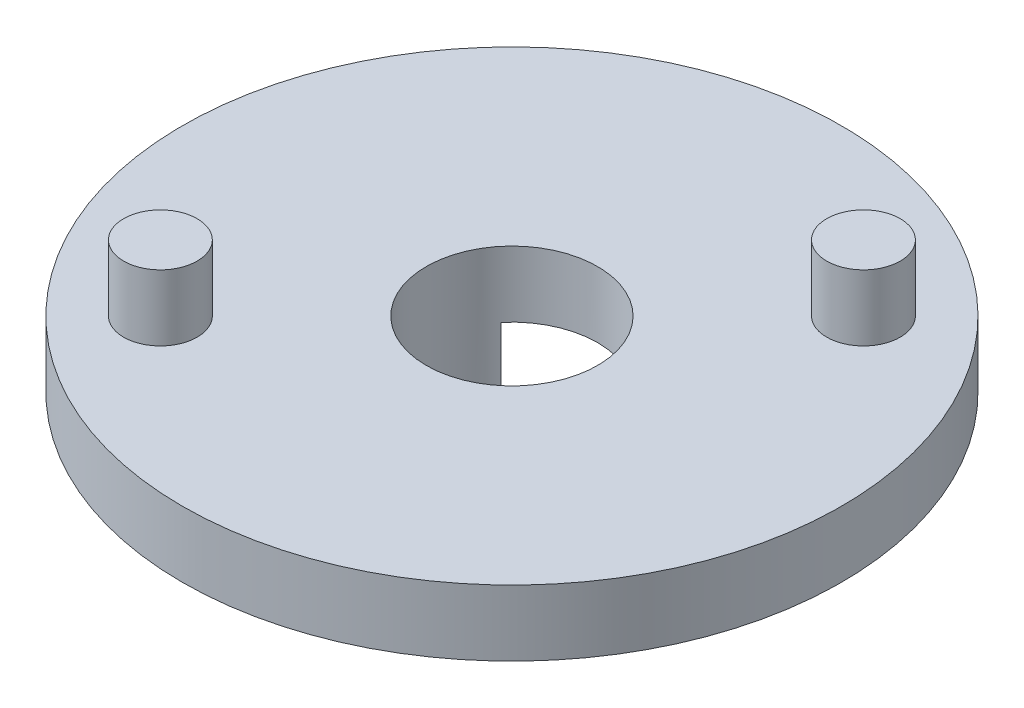
ISO-10303-21;
HEADER;
FILE_DESCRIPTION(('STEP AP214'),'2;1');
FILE_NAME('part.step','',(''),(''),'','','');
FILE_SCHEMA(('AUTOMOTIVE_DESIGN { 1 0 10303 214 1 1 1 1 }'));
ENDSEC;
DATA;
#1=APPLICATION_CONTEXT('core data for automotive mechanical design processes');
#2=APPLICATION_PROTOCOL_DEFINITION('international standard','automotive_design',2000,#1);
#3=PRODUCT_CONTEXT('',#1,'mechanical');
#4=PRODUCT('Part','Part','',(#3));
#5=PRODUCT_RELATED_PRODUCT_CATEGORY('part','',(#4));
#6=PRODUCT_DEFINITION_FORMATION('','',#4);
#7=PRODUCT_DEFINITION_CONTEXT('part definition',#1,'design');
#8=PRODUCT_DEFINITION('design','',#6,#7);
#9=PRODUCT_DEFINITION_SHAPE('','',#8);
#10=(LENGTH_UNIT() NAMED_UNIT(*) SI_UNIT(.MILLI.,.METRE.));
#11=(NAMED_UNIT(*) PLANE_ANGLE_UNIT() SI_UNIT($,.RADIAN.));
#12=(NAMED_UNIT(*) SI_UNIT($,.STERADIAN.) SOLID_ANGLE_UNIT());
#13=UNCERTAINTY_MEASURE_WITH_UNIT(LENGTH_MEASURE(1.E-05),#10,'distance_accuracy_value','');
#14=(GEOMETRIC_REPRESENTATION_CONTEXT(3) GLOBAL_UNCERTAINTY_ASSIGNED_CONTEXT((#13)) GLOBAL_UNIT_ASSIGNED_CONTEXT((#10,
#11,#12)) REPRESENTATION_CONTEXT('',''));
#15=CARTESIAN_POINT('',(0.,0.,0.));
#16=DIRECTION('',(0.,0.,1.));
#17=DIRECTION('',(1.,0.,0.));
#18=AXIS2_PLACEMENT_3D('',#15,#16,#17);
#19=CARTESIAN_POINT('',(-2.6167728216259,1.75,1.25));
#20=DIRECTION('',(0.,0.,-1.));
#21=DIRECTION('',(-1.,0.,0.));
#22=AXIS2_PLACEMENT_3D('',#19,#20,#21);
#23=PLANE('',#22);
#24=DIRECTION('',(1.,0.,0.));
#25=VECTOR('',#24,1.);
#26=CARTESIAN_POINT('',(-2.6167728216259,0.,1.25));
#27=LINE('',#26,#25);
#28=CARTESIAN_POINT('',(-2.6167728216259,0.,1.25));
#29=VERTEX_POINT('',#28);
#30=CARTESIAN_POINT('',(-1.49666295470958,0.,1.25));
#31=VERTEX_POINT('',#30);
#32=EDGE_CURVE('E98',#29,#31,#27,.T.);
#33=ORIENTED_EDGE('',*,*,#32,.T.);
#34=DIRECTION('',(0.,1.,0.));
#35=VECTOR('',#34,1.);
#36=CARTESIAN_POINT('',(-1.49666295470958,0.,1.25));
#37=LINE('',#36,#35);
#38=CARTESIAN_POINT('',(-1.49666295470958,1.75,1.25));
#39=VERTEX_POINT('',#38);
#40=EDGE_CURVE('E174',#31,#39,#37,.T.);
#41=ORIENTED_EDGE('',*,*,#40,.T.);
#42=DIRECTION('',(1.,0.,0.));
#43=VECTOR('',#42,1.);
#44=CARTESIAN_POINT('',(-2.6167728216259,1.75,1.25));
#45=LINE('',#44,#43);
#46=CARTESIAN_POINT('',(-2.6167728216259,1.75,1.25));
#47=VERTEX_POINT('',#46);
#48=EDGE_CURVE('E138',#47,#39,#45,.T.);
#49=ORIENTED_EDGE('',*,*,#48,.F.);
#50=DIRECTION('',(0.,-1.,0.));
#51=VECTOR('',#50,1.);
#52=CARTESIAN_POINT('',(-2.6167728216259,1.75,1.25));
#53=LINE('',#52,#51);
#54=EDGE_CURVE('E11',#47,#29,#53,.T.);
#55=ORIENTED_EDGE('',*,*,#54,.T.);
#56=EDGE_LOOP('',(#33,#41,#49,#55));
#57=FACE_BOUND('',#56,.T.);
#58=ADVANCED_FACE('F36',(#57),#23,.F.);
#59=CARTESIAN_POINT('',(-2.6167728216259,1.75,-1.25));
#60=DIRECTION('',(0.,0.,-1.));
#61=DIRECTION('',(-1.,0.,0.));
#62=AXIS2_PLACEMENT_3D('',#59,#60,#61);
#63=PLANE('',#62);
#64=DIRECTION('',(0.,1.,0.));
#65=VECTOR('',#64,1.);
#66=CARTESIAN_POINT('',(-1.49666295470958,0.,-1.25));
#67=LINE('',#66,#65);
#68=CARTESIAN_POINT('',(-1.49666295470958,0.,-1.25));
#69=VERTEX_POINT('',#68);
#70=CARTESIAN_POINT('',(-1.49666295470958,1.75,-1.25));
#71=VERTEX_POINT('',#70);
#72=EDGE_CURVE('E131',#69,#71,#67,.T.);
#73=ORIENTED_EDGE('',*,*,#72,.F.);
#74=DIRECTION('',(1.,0.,0.));
#75=VECTOR('',#74,1.);
#76=CARTESIAN_POINT('',(-2.6167728216259,0.,-1.25));
#77=LINE('',#76,#75);
#78=CARTESIAN_POINT('',(-2.6167728216259,0.,-1.25));
#79=VERTEX_POINT('',#78);
#80=EDGE_CURVE('E86',#79,#69,#77,.T.);
#81=ORIENTED_EDGE('',*,*,#80,.F.);
#82=DIRECTION('',(0.,-1.,0.));
#83=VECTOR('',#82,1.);
#84=CARTESIAN_POINT('',(-2.6167728216259,1.75,-1.25));
#85=LINE('',#84,#83);
#86=CARTESIAN_POINT('',(-2.6167728216259,1.75,-1.25));
#87=VERTEX_POINT('',#86);
#88=EDGE_CURVE('E93',#87,#79,#85,.T.);
#89=ORIENTED_EDGE('',*,*,#88,.F.);
#90=DIRECTION('',(1.,0.,0.));
#91=VECTOR('',#90,1.);
#92=CARTESIAN_POINT('',(-2.6167728216259,1.75,-1.25));
#93=LINE('',#92,#91);
#94=EDGE_CURVE('E107',#87,#71,#93,.T.);
#95=ORIENTED_EDGE('',*,*,#94,.T.);
#96=EDGE_LOOP('',(#73,#81,#89,#95));
#97=FACE_BOUND('',#96,.T.);
#98=ADVANCED_FACE('F171',(#97),#63,.T.);
#99=CARTESIAN_POINT('',(0.,0.,0.));
#100=DIRECTION('',(0.,1.,0.));
#101=DIRECTION('',(0.,0.,1.));
#102=AXIS2_PLACEMENT_3D('',#99,#100,#101);
#103=PLANE('',#102);
#104=CARTESIAN_POINT('',(1.49666295470958,0.,1.25));
#105=VERTEX_POINT('',#104);
#106=CARTESIAN_POINT('',(2.6167728216259,0.,1.25));
#107=VERTEX_POINT('',#106);
#108=EDGE_CURVE('E101',#105,#107,#27,.T.);
#109=ORIENTED_EDGE('',*,*,#108,.F.);
#110=CARTESIAN_POINT('',(0.,0.,0.));
#111=DIRECTION('',(0.,1.,0.));
#112=DIRECTION('',(0.,0.,1.));
#113=AXIS2_PLACEMENT_3D('',#110,#111,#112);
#114=CIRCLE('',#113,1.95);
#115=CARTESIAN_POINT('',(1.49666295470958,0.,-1.25));
#116=VERTEX_POINT('',#115);
#117=EDGE_CURVE('E85',#105,#116,#114,.T.);
#118=ORIENTED_EDGE('',*,*,#117,.T.);
#119=CARTESIAN_POINT('',(2.6167728216259,0.,-1.25));
#120=VERTEX_POINT('',#119);
#121=EDGE_CURVE('E79',#116,#120,#77,.T.);
#122=ORIENTED_EDGE('',*,*,#121,.T.);
#123=CARTESIAN_POINT('',(0.,0.,0.));
#124=DIRECTION('',(0.,1.,0.));
#125=DIRECTION('',(0.,0.,1.));
#126=AXIS2_PLACEMENT_3D('',#123,#124,#125);
#127=CIRCLE('',#126,2.9);
#128=EDGE_CURVE('E83',#107,#120,#127,.T.);
#129=ORIENTED_EDGE('',*,*,#128,.F.);
#130=EDGE_LOOP('',(#109,#118,#122,#129));
#131=FACE_BOUND('',#130,.T.);
#132=ADVANCED_FACE('F81',(#131),#103,.F.);
#133=CARTESIAN_POINT('',(0.,1.75,0.));
#134=DIRECTION('',(0.,-1.,0.));
#135=DIRECTION('',(0.,0.,-1.));
#136=AXIS2_PLACEMENT_3D('',#133,#134,#135);
#137=CYLINDRICAL_SURFACE('',#136,2.9);
#138=CARTESIAN_POINT('',(0.,0.,0.));
#139=DIRECTION('',(0.,1.,0.));
#140=DIRECTION('',(0.,0.,1.));
#141=AXIS2_PLACEMENT_3D('',#138,#139,#140);
#142=CIRCLE('',#141,2.9);
#143=EDGE_CURVE('E122',#79,#29,#142,.T.);
#144=ORIENTED_EDGE('',*,*,#143,.T.);
#145=ORIENTED_EDGE('',*,*,#54,.F.);
#146=CARTESIAN_POINT('',(0.,1.75,0.));
#147=DIRECTION('',(0.,1.,0.));
#148=DIRECTION('',(0.,0.,1.));
#149=AXIS2_PLACEMENT_3D('',#146,#147,#148);
#150=CIRCLE('',#149,2.9);
#151=EDGE_CURVE('E106',#87,#47,#150,.T.);
#152=ORIENTED_EDGE('',*,*,#151,.F.);
#153=ORIENTED_EDGE('',*,*,#88,.T.);
#154=EDGE_LOOP('',(#144,#145,#152,#153));
#155=FACE_BOUND('',#154,.T.);
#156=ADVANCED_FACE('F38',(#155),#137,.T.);
#157=CARTESIAN_POINT('',(1.49666295470958,1.75,1.25));
#158=VERTEX_POINT('',#157);
#159=CARTESIAN_POINT('',(2.6167728216259,1.75,1.25));
#160=VERTEX_POINT('',#159);
#161=EDGE_CURVE('E137',#158,#160,#45,.T.);
#162=ORIENTED_EDGE('',*,*,#161,.F.);
#163=DIRECTION('',(0.,1.,0.));
#164=VECTOR('',#163,1.);
#165=CARTESIAN_POINT('',(1.49666295470958,0.,1.25));
#166=LINE('',#165,#164);
#167=EDGE_CURVE('E51',#158,#105,#166,.F.);
#168=ORIENTED_EDGE('',*,*,#167,.T.);
#169=ORIENTED_EDGE('',*,*,#108,.T.);
#170=DIRECTION('',(0.,-1.,0.));
#171=VECTOR('',#170,1.);
#172=CARTESIAN_POINT('',(2.6167728216259,1.75,1.25));
#173=LINE('',#172,#171);
#174=EDGE_CURVE('E44',#160,#107,#173,.T.);
#175=ORIENTED_EDGE('',*,*,#174,.F.);
#176=EDGE_LOOP('',(#162,#168,#169,#175));
#177=FACE_BOUND('',#176,.T.);
#178=ADVANCED_FACE('F150',(#177),#23,.F.);
#179=CARTESIAN_POINT('',(0.,1.75,0.));
#180=DIRECTION('',(0.,-1.,0.));
#181=DIRECTION('',(0.,0.,-1.));
#182=AXIS2_PLACEMENT_3D('',#179,#180,#181);
#183=CYLINDRICAL_SURFACE('',#182,2.9);
#184=ORIENTED_EDGE('',*,*,#128,.T.);
#185=DIRECTION('',(0.,-1.,0.));
#186=VECTOR('',#185,1.);
#187=CARTESIAN_POINT('',(2.6167728216259,1.75,-1.25));
#188=LINE('',#187,#186);
#189=CARTESIAN_POINT('',(2.6167728216259,1.75,-1.25));
#190=VERTEX_POINT('',#189);
#191=EDGE_CURVE('E89',#190,#120,#188,.T.);
#192=ORIENTED_EDGE('',*,*,#191,.F.);
#193=CARTESIAN_POINT('',(0.,1.75,0.));
#194=DIRECTION('',(0.,1.,0.));
#195=DIRECTION('',(0.,0.,1.));
#196=AXIS2_PLACEMENT_3D('',#193,#194,#195);
#197=CIRCLE('',#196,2.9);
#198=EDGE_CURVE('E119',#160,#190,#197,.T.);
#199=ORIENTED_EDGE('',*,*,#198,.F.);
#200=ORIENTED_EDGE('',*,*,#174,.T.);
#201=EDGE_LOOP('',(#184,#192,#199,#200));
#202=FACE_BOUND('',#201,.T.);
#203=ADVANCED_FACE('F96',(#202),#183,.T.);
#204=DIRECTION('',(0.,1.,0.));
#205=VECTOR('',#204,1.);
#206=CARTESIAN_POINT('',(1.49666295470958,0.,-1.25));
#207=LINE('',#206,#205);
#208=CARTESIAN_POINT('',(1.49666295470958,1.75,-1.25));
#209=VERTEX_POINT('',#208);
#210=EDGE_CURVE('E177',#209,#116,#207,.F.);
#211=ORIENTED_EDGE('',*,*,#210,.F.);
#212=EDGE_CURVE('E60',#209,#190,#93,.T.);
#213=ORIENTED_EDGE('',*,*,#212,.T.);
#214=ORIENTED_EDGE('',*,*,#191,.T.);
#215=ORIENTED_EDGE('',*,*,#121,.F.);
#216=EDGE_LOOP('',(#211,#213,#214,#215));
#217=FACE_BOUND('',#216,.T.);
#218=ADVANCED_FACE('F90',(#217),#63,.T.);
#219=ORIENTED_EDGE('',*,*,#80,.T.);
#220=EDGE_CURVE('E182',#69,#31,#114,.T.);
#221=ORIENTED_EDGE('',*,*,#220,.T.);
#222=ORIENTED_EDGE('',*,*,#32,.F.);
#223=ORIENTED_EDGE('',*,*,#143,.F.);
#224=EDGE_LOOP('',(#219,#221,#222,#223));
#225=FACE_BOUND('',#224,.T.);
#226=ADVANCED_FACE('F184',(#225),#103,.F.);
#227=CARTESIAN_POINT('',(0.,1.75,0.));
#228=DIRECTION('',(0.,1.,0.));
#229=DIRECTION('',(0.,0.,1.));
#230=AXIS2_PLACEMENT_3D('',#227,#228,#229);
#231=PLANE('',#230);
#232=CARTESIAN_POINT('',(0.,1.75,0.));
#233=DIRECTION('',(0.,1.,0.));
#234=DIRECTION('',(0.,0.,1.));
#235=AXIS2_PLACEMENT_3D('',#232,#233,#234);
#236=CIRCLE('',#235,7.5);
#237=CARTESIAN_POINT('',(0.,1.75,7.5));
#238=VERTEX_POINT('',#237);
#239=EDGE_CURVE('E126',#238,#238,#236,.T.);
#240=ORIENTED_EDGE('',*,*,#239,.F.);
#241=EDGE_LOOP('',(#240));
#242=FACE_BOUND('',#241,.T.);
#243=ORIENTED_EDGE('',*,*,#212,.F.);
#244=CARTESIAN_POINT('',(0.,1.75,0.));
#245=DIRECTION('',(0.,1.,0.));
#246=DIRECTION('',(0.,0.,1.));
#247=AXIS2_PLACEMENT_3D('',#244,#245,#246);
#248=CIRCLE('',#247,1.95);
#249=EDGE_CURVE('E169',#209,#71,#248,.T.);
#250=ORIENTED_EDGE('',*,*,#249,.T.);
#251=ORIENTED_EDGE('',*,*,#94,.F.);
#252=ORIENTED_EDGE('',*,*,#151,.T.);
#253=ORIENTED_EDGE('',*,*,#48,.T.);
#254=EDGE_CURVE('E147',#39,#158,#248,.T.);
#255=ORIENTED_EDGE('',*,*,#254,.T.);
#256=ORIENTED_EDGE('',*,*,#161,.T.);
#257=ORIENTED_EDGE('',*,*,#198,.T.);
#258=EDGE_LOOP('',(#243,#250,#251,#252,#253,#255,#256,#257));
#259=FACE_BOUND('',#258,.T.);
#260=ADVANCED_FACE('F146',(#242,#259),#231,.F.);
#261=CARTESIAN_POINT('',(0.,3.25,0.));
#262=DIRECTION('',(0.,-1.,0.));
#263=DIRECTION('',(0.,0.,-1.));
#264=AXIS2_PLACEMENT_3D('',#261,#262,#263);
#265=CYLINDRICAL_SURFACE('',#264,7.5);
#266=CARTESIAN_POINT('',(0.,3.25,0.));
#267=DIRECTION('',(0.,1.,0.));
#268=DIRECTION('',(0.,0.,1.));
#269=AXIS2_PLACEMENT_3D('',#266,#267,#268);
#270=CIRCLE('',#269,7.5);
#271=CARTESIAN_POINT('',(0.,3.25,7.5));
#272=VERTEX_POINT('',#271);
#273=EDGE_CURVE('E123',#272,#272,#270,.T.);
#274=ORIENTED_EDGE('',*,*,#273,.F.);
#275=EDGE_LOOP('',(#274));
#276=FACE_BOUND('',#275,.T.);
#277=ORIENTED_EDGE('',*,*,#239,.T.);
#278=EDGE_LOOP('',(#277));
#279=FACE_BOUND('',#278,.T.);
#280=ADVANCED_FACE('F215',(#276,#279),#265,.T.);
#281=CARTESIAN_POINT('',(0.,3.25,0.));
#282=DIRECTION('',(0.,1.,0.));
#283=DIRECTION('',(0.,0.,1.));
#284=AXIS2_PLACEMENT_3D('',#281,#282,#283);
#285=PLANE('',#284);
#286=CARTESIAN_POINT('',(-4.,3.25,4.));
#287=DIRECTION('',(0.,1.,0.));
#288=DIRECTION('',(0.,0.,1.));
#289=AXIS2_PLACEMENT_3D('',#286,#287,#288);
#290=CIRCLE('',#289,0.8365);
#291=CARTESIAN_POINT('',(-4.,3.25,4.8365));
#292=VERTEX_POINT('',#291);
#293=EDGE_CURVE('E197',#292,#292,#290,.T.);
#294=ORIENTED_EDGE('',*,*,#293,.F.);
#295=EDGE_LOOP('',(#294));
#296=FACE_BOUND('',#295,.T.);
#297=CARTESIAN_POINT('',(4.,3.25,-4.));
#298=DIRECTION('',(0.,1.,0.));
#299=DIRECTION('',(0.,0.,1.));
#300=AXIS2_PLACEMENT_3D('',#297,#298,#299);
#301=CIRCLE('',#300,0.8365);
#302=CARTESIAN_POINT('',(4.,3.25,-3.1635));
#303=VERTEX_POINT('',#302);
#304=EDGE_CURVE('E191',#303,#303,#301,.T.);
#305=ORIENTED_EDGE('',*,*,#304,.F.);
#306=EDGE_LOOP('',(#305));
#307=FACE_BOUND('',#306,.T.);
#308=CARTESIAN_POINT('',(0.,3.25,0.));
#309=DIRECTION('',(0.,1.,0.));
#310=DIRECTION('',(0.,0.,1.));
#311=AXIS2_PLACEMENT_3D('',#308,#309,#310);
#312=CIRCLE('',#311,1.95);
#313=CARTESIAN_POINT('',(0.,3.25,1.95));
#314=VERTEX_POINT('',#313);
#315=EDGE_CURVE('E185',#314,#314,#312,.T.);
#316=ORIENTED_EDGE('',*,*,#315,.F.);
#317=EDGE_LOOP('',(#316));
#318=FACE_BOUND('',#317,.T.);
#319=ORIENTED_EDGE('',*,*,#273,.T.);
#320=EDGE_LOOP('',(#319));
#321=FACE_BOUND('',#320,.T.);
#322=ADVANCED_FACE('F212',(#296,#307,#318,#321),#285,.T.);
#323=CARTESIAN_POINT('',(0.,0.,0.));
#324=DIRECTION('',(0.,1.,0.));
#325=DIRECTION('',(0.,0.,1.));
#326=AXIS2_PLACEMENT_3D('',#323,#324,#325);
#327=CYLINDRICAL_SURFACE('',#326,1.95);
#328=ORIENTED_EDGE('',*,*,#72,.T.);
#329=ORIENTED_EDGE('',*,*,#249,.F.);
#330=ORIENTED_EDGE('',*,*,#210,.T.);
#331=ORIENTED_EDGE('',*,*,#117,.F.);
#332=ORIENTED_EDGE('',*,*,#167,.F.);
#333=ORIENTED_EDGE('',*,*,#254,.F.);
#334=ORIENTED_EDGE('',*,*,#40,.F.);
#335=ORIENTED_EDGE('',*,*,#220,.F.);
#336=EDGE_LOOP('',(#328,#329,#330,#331,#332,#333,#334,#335));
#337=FACE_BOUND('',#336,.T.);
#338=ORIENTED_EDGE('',*,*,#315,.T.);
#339=EDGE_LOOP('',(#338));
#340=FACE_BOUND('',#339,.T.);
#341=ADVANCED_FACE('F180',(#337,#340),#327,.F.);
#342=CARTESIAN_POINT('',(4.,4.75,-4.));
#343=DIRECTION('',(0.,-1.,0.));
#344=DIRECTION('',(0.,0.,-1.));
#345=AXIS2_PLACEMENT_3D('',#342,#343,#344);
#346=CYLINDRICAL_SURFACE('',#345,0.8365);
#347=CARTESIAN_POINT('',(4.,4.75,-4.));
#348=DIRECTION('',(0.,1.,0.));
#349=DIRECTION('',(0.,0.,1.));
#350=AXIS2_PLACEMENT_3D('',#347,#348,#349);
#351=CIRCLE('',#350,0.8365);
#352=CARTESIAN_POINT('',(4.,4.75,-3.1635));
#353=VERTEX_POINT('',#352);
#354=EDGE_CURVE('E188',#353,#353,#351,.T.);
#355=ORIENTED_EDGE('',*,*,#354,.F.);
#356=EDGE_LOOP('',(#355));
#357=FACE_BOUND('',#356,.T.);
#358=ORIENTED_EDGE('',*,*,#304,.T.);
#359=EDGE_LOOP('',(#358));
#360=FACE_BOUND('',#359,.T.);
#361=ADVANCED_FACE('F221',(#357,#360),#346,.T.);
#362=CARTESIAN_POINT('',(4.,4.75,-4.));
#363=DIRECTION('',(0.,1.,0.));
#364=DIRECTION('',(0.,0.,1.));
#365=AXIS2_PLACEMENT_3D('',#362,#363,#364);
#366=PLANE('',#365);
#367=ORIENTED_EDGE('',*,*,#354,.T.);
#368=EDGE_LOOP('',(#367));
#369=FACE_BOUND('',#368,.T.);
#370=ADVANCED_FACE('F208',(#369),#366,.T.);
#371=CARTESIAN_POINT('',(-4.,4.75,4.));
#372=DIRECTION('',(0.,-1.,0.));
#373=DIRECTION('',(0.,0.,-1.));
#374=AXIS2_PLACEMENT_3D('',#371,#372,#373);
#375=CYLINDRICAL_SURFACE('',#374,0.8365);
#376=CARTESIAN_POINT('',(-4.,4.75,4.));
#377=DIRECTION('',(0.,1.,0.));
#378=DIRECTION('',(0.,0.,1.));
#379=AXIS2_PLACEMENT_3D('',#376,#377,#378);
#380=CIRCLE('',#379,0.8365);
#381=CARTESIAN_POINT('',(-4.,4.75,4.8365));
#382=VERTEX_POINT('',#381);
#383=EDGE_CURVE('E194',#382,#382,#380,.T.);
#384=ORIENTED_EDGE('',*,*,#383,.F.);
#385=EDGE_LOOP('',(#384));
#386=FACE_BOUND('',#385,.T.);
#387=ORIENTED_EDGE('',*,*,#293,.T.);
#388=EDGE_LOOP('',(#387));
#389=FACE_BOUND('',#388,.T.);
#390=ADVANCED_FACE('F205',(#386,#389),#375,.T.);
#391=CARTESIAN_POINT('',(-4.,4.75,4.));
#392=DIRECTION('',(0.,1.,0.));
#393=DIRECTION('',(0.,0.,1.));
#394=AXIS2_PLACEMENT_3D('',#391,#392,#393);
#395=PLANE('',#394);
#396=ORIENTED_EDGE('',*,*,#383,.T.);
#397=EDGE_LOOP('',(#396));
#398=FACE_BOUND('',#397,.T.);
#399=ADVANCED_FACE('F203',(#398),#395,.T.);
#400=CLOSED_SHELL('',(#58,#98,#132,#156,#178,#203,#218,#226,#260,#280,#322,#341,#361,#370,#390,#399));
#401=MANIFOLD_SOLID_BREP('B2',#400);
#402=ADVANCED_BREP_SHAPE_REPRESENTATION('',(#18,#401),#14);
#403=SHAPE_DEFINITION_REPRESENTATION(#9,#402);
ENDSEC;
END-ISO-10303-21;
